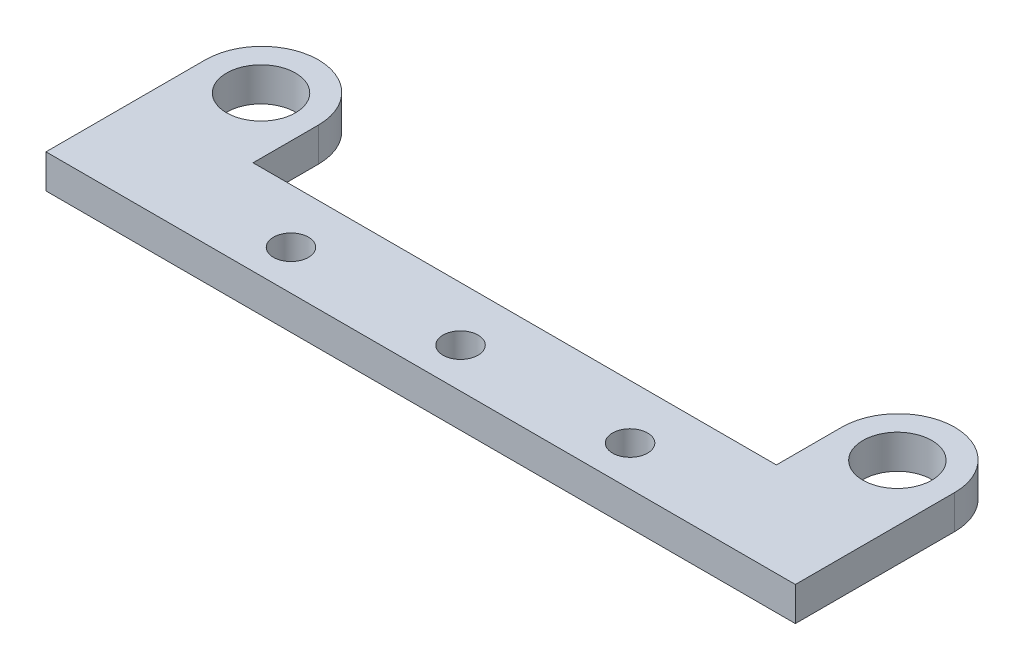
ISO-10303-21;
HEADER;
FILE_DESCRIPTION(('STEP AP214'),'2;1');
FILE_NAME('part.step','',(''),(''),'','','');
FILE_SCHEMA(('AUTOMOTIVE_DESIGN { 1 0 10303 214 1 1 1 1 }'));
ENDSEC;
DATA;
#1=APPLICATION_CONTEXT('core data for automotive mechanical design processes');
#2=APPLICATION_PROTOCOL_DEFINITION('international standard','automotive_design',2000,#1);
#3=PRODUCT_CONTEXT('',#1,'mechanical');
#4=PRODUCT('Part','Part','',(#3));
#5=PRODUCT_RELATED_PRODUCT_CATEGORY('part','',(#4));
#6=PRODUCT_DEFINITION_FORMATION('','',#4);
#7=PRODUCT_DEFINITION_CONTEXT('part definition',#1,'design');
#8=PRODUCT_DEFINITION('design','',#6,#7);
#9=PRODUCT_DEFINITION_SHAPE('','',#8);
#10=(LENGTH_UNIT() NAMED_UNIT(*) SI_UNIT(.MILLI.,.METRE.));
#11=(NAMED_UNIT(*) PLANE_ANGLE_UNIT() SI_UNIT($,.RADIAN.));
#12=(NAMED_UNIT(*) SI_UNIT($,.STERADIAN.) SOLID_ANGLE_UNIT());
#13=UNCERTAINTY_MEASURE_WITH_UNIT(LENGTH_MEASURE(1.E-05),#10,'distance_accuracy_value','');
#14=(GEOMETRIC_REPRESENTATION_CONTEXT(3) GLOBAL_UNCERTAINTY_ASSIGNED_CONTEXT((#13)) GLOBAL_UNIT_ASSIGNED_CONTEXT((#10,
#11,#12)) REPRESENTATION_CONTEXT('',''));
#15=CARTESIAN_POINT('',(0.,0.,0.));
#16=DIRECTION('',(0.,0.,1.));
#17=DIRECTION('',(1.,0.,0.));
#18=AXIS2_PLACEMENT_3D('',#15,#16,#17);
#19=CARTESIAN_POINT('',(0.,3.,0.));
#20=DIRECTION('',(0.,1.,0.));
#21=DIRECTION('',(1.,0.,0.));
#22=AXIS2_PLACEMENT_3D('',#19,#20,#21);
#23=PLANE('',#22);
#24=CARTESIAN_POINT('',(28.15,3.,5.075));
#25=DIRECTION('',(0.,-1.,0.));
#26=DIRECTION('',(0.,0.,1.));
#27=AXIS2_PLACEMENT_3D('',#24,#25,#26);
#28=CIRCLE('',#27,3.05);
#29=CARTESIAN_POINT('',(28.15,3.,2.025));
#30=VERTEX_POINT('',#29);
#31=EDGE_CURVE('E147',#30,#30,#28,.T.);
#32=ORIENTED_EDGE('',*,*,#31,.T.);
#33=EDGE_LOOP('',(#32));
#34=FACE_BOUND('',#33,.T.);
#35=CARTESIAN_POINT('',(-15.,3.,15.575));
#36=DIRECTION('',(0.,-1.,0.));
#37=DIRECTION('',(0.,0.,-1.));
#38=AXIS2_PLACEMENT_3D('',#35,#36,#37);
#39=CIRCLE('',#38,1.55);
#40=CARTESIAN_POINT('',(-15.,3.,17.125));
#41=VERTEX_POINT('',#40);
#42=EDGE_CURVE('E224',#41,#41,#39,.T.);
#43=ORIENTED_EDGE('',*,*,#42,.T.);
#44=EDGE_LOOP('',(#43));
#45=FACE_BOUND('',#44,.T.);
#46=CARTESIAN_POINT('',(0.,3.,15.575));
#47=DIRECTION('',(0.,-1.,0.));
#48=DIRECTION('',(0.,0.,-1.));
#49=AXIS2_PLACEMENT_3D('',#46,#47,#48);
#50=CIRCLE('',#49,1.55);
#51=CARTESIAN_POINT('',(0.,3.,17.125));
#52=VERTEX_POINT('',#51);
#53=EDGE_CURVE('E209',#52,#52,#50,.T.);
#54=ORIENTED_EDGE('',*,*,#53,.T.);
#55=EDGE_LOOP('',(#54));
#56=FACE_BOUND('',#55,.T.);
#57=CARTESIAN_POINT('',(15.,3.,15.575));
#58=DIRECTION('',(0.,-1.,0.));
#59=DIRECTION('',(0.,0.,-1.));
#60=AXIS2_PLACEMENT_3D('',#57,#58,#59);
#61=CIRCLE('',#60,1.55);
#62=CARTESIAN_POINT('',(15.,3.,17.125));
#63=VERTEX_POINT('',#62);
#64=EDGE_CURVE('E168',#63,#63,#61,.T.);
#65=ORIENTED_EDGE('',*,*,#64,.T.);
#66=EDGE_LOOP('',(#65));
#67=FACE_BOUND('',#66,.T.);
#68=CARTESIAN_POINT('',(-28.15,3.,5.075));
#69=DIRECTION('',(0.,-1.,0.));
#70=DIRECTION('',(0.,0.,-1.));
#71=AXIS2_PLACEMENT_3D('',#68,#69,#70);
#72=CIRCLE('',#71,3.05);
#73=CARTESIAN_POINT('',(-28.15,3.,8.125));
#74=VERTEX_POINT('',#73);
#75=EDGE_CURVE('E180',#74,#74,#72,.T.);
#76=ORIENTED_EDGE('',*,*,#75,.T.);
#77=EDGE_LOOP('',(#76));
#78=FACE_BOUND('',#77,.T.);
#79=DIRECTION('',(0.,0.,1.));
#80=VECTOR('',#79,1.);
#81=CARTESIAN_POINT('',(-23.15,3.,10.78));
#82=LINE('',#81,#80);
#83=CARTESIAN_POINT('',(-23.15,3.,5.));
#84=VERTEX_POINT('',#83);
#85=CARTESIAN_POINT('',(-23.15,3.,10.78));
#86=VERTEX_POINT('',#85);
#87=EDGE_CURVE('E215',#84,#86,#82,.T.);
#88=ORIENTED_EDGE('',*,*,#87,.F.);
#89=CARTESIAN_POINT('',(-28.15,3.,5.));
#90=DIRECTION('',(0.,-1.,0.));
#91=DIRECTION('',(0.,0.,-1.));
#92=AXIS2_PLACEMENT_3D('',#89,#90,#91);
#93=CIRCLE('',#92,5.);
#94=CARTESIAN_POINT('',(-33.15,3.,5.));
#95=VERTEX_POINT('',#94);
#96=EDGE_CURVE('E140',#95,#84,#93,.T.);
#97=ORIENTED_EDGE('',*,*,#96,.F.);
#98=DIRECTION('',(0.,0.,-1.));
#99=VECTOR('',#98,1.);
#100=CARTESIAN_POINT('',(-33.15,3.,0.));
#101=LINE('',#100,#99);
#102=CARTESIAN_POINT('',(-33.15,3.,19.1));
#103=VERTEX_POINT('',#102);
#104=EDGE_CURVE('E11',#103,#95,#101,.T.);
#105=ORIENTED_EDGE('',*,*,#104,.F.);
#106=DIRECTION('',(-1.,0.,0.));
#107=VECTOR('',#106,1.);
#108=CARTESIAN_POINT('',(-33.15,3.,19.1));
#109=LINE('',#108,#107);
#110=CARTESIAN_POINT('',(33.15,3.,19.1));
#111=VERTEX_POINT('',#110);
#112=EDGE_CURVE('E28',#111,#103,#109,.T.);
#113=ORIENTED_EDGE('',*,*,#112,.F.);
#114=DIRECTION('',(0.,0.,1.));
#115=VECTOR('',#114,1.);
#116=CARTESIAN_POINT('',(33.15,3.,19.1));
#117=LINE('',#116,#115);
#118=CARTESIAN_POINT('',(33.15,3.,5.));
#119=VERTEX_POINT('',#118);
#120=EDGE_CURVE('E129',#119,#111,#117,.T.);
#121=ORIENTED_EDGE('',*,*,#120,.F.);
#122=CARTESIAN_POINT('',(28.15,3.,5.));
#123=DIRECTION('',(0.,-1.,0.));
#124=DIRECTION('',(0.,0.,-1.));
#125=AXIS2_PLACEMENT_3D('',#122,#123,#124);
#126=CIRCLE('',#125,5.);
#127=CARTESIAN_POINT('',(23.15,3.,5.));
#128=VERTEX_POINT('',#127);
#129=EDGE_CURVE('E136',#128,#119,#126,.T.);
#130=ORIENTED_EDGE('',*,*,#129,.F.);
#131=DIRECTION('',(0.,0.,-1.));
#132=VECTOR('',#131,1.);
#133=CARTESIAN_POINT('',(23.15,3.,0.));
#134=LINE('',#133,#132);
#135=CARTESIAN_POINT('',(23.15,3.,10.78));
#136=VERTEX_POINT('',#135);
#137=EDGE_CURVE('E117',#136,#128,#134,.T.);
#138=ORIENTED_EDGE('',*,*,#137,.F.);
#139=DIRECTION('',(1.,0.,0.));
#140=VECTOR('',#139,1.);
#141=CARTESIAN_POINT('',(23.15,3.,10.78));
#142=LINE('',#141,#140);
#143=EDGE_CURVE('E130',#86,#136,#142,.T.);
#144=ORIENTED_EDGE('',*,*,#143,.F.);
#145=EDGE_LOOP('',(#88,#97,#105,#113,#121,#130,#138,#144));
#146=FACE_BOUND('',#145,.T.);
#147=ADVANCED_FACE('F17',(#34,#45,#56,#67,#78,#146),#23,.T.);
#148=CARTESIAN_POINT('',(-33.15,0.,0.));
#149=DIRECTION('',(-1.,0.,0.));
#150=DIRECTION('',(0.,0.,1.));
#151=AXIS2_PLACEMENT_3D('',#148,#149,#150);
#152=PLANE('',#151);
#153=ORIENTED_EDGE('',*,*,#104,.T.);
#154=DIRECTION('',(0.,-1.,0.));
#155=VECTOR('',#154,1.);
#156=CARTESIAN_POINT('',(-33.15,0.,5.));
#157=LINE('',#156,#155);
#158=CARTESIAN_POINT('',(-33.15,0.,5.));
#159=VERTEX_POINT('',#158);
#160=EDGE_CURVE('E179',#95,#159,#157,.T.);
#161=ORIENTED_EDGE('',*,*,#160,.T.);
#162=DIRECTION('',(0.,0.,1.));
#163=VECTOR('',#162,1.);
#164=CARTESIAN_POINT('',(-33.15,0.,0.));
#165=LINE('',#164,#163);
#166=CARTESIAN_POINT('',(-33.15,0.,19.1));
#167=VERTEX_POINT('',#166);
#168=EDGE_CURVE('E160',#159,#167,#165,.T.);
#169=ORIENTED_EDGE('',*,*,#168,.T.);
#170=DIRECTION('',(0.,-1.,0.));
#171=VECTOR('',#170,1.);
#172=CARTESIAN_POINT('',(-33.15,0.,19.1));
#173=LINE('',#172,#171);
#174=EDGE_CURVE('E167',#103,#167,#173,.T.);
#175=ORIENTED_EDGE('',*,*,#174,.F.);
#176=EDGE_LOOP('',(#153,#161,#169,#175));
#177=FACE_BOUND('',#176,.T.);
#178=ADVANCED_FACE('F284',(#177),#152,.T.);
#179=CARTESIAN_POINT('',(-33.15,0.,19.1));
#180=DIRECTION('',(0.,0.,1.));
#181=DIRECTION('',(1.,0.,0.));
#182=AXIS2_PLACEMENT_3D('',#179,#180,#181);
#183=PLANE('',#182);
#184=ORIENTED_EDGE('',*,*,#174,.T.);
#185=DIRECTION('',(1.,0.,0.));
#186=VECTOR('',#185,1.);
#187=CARTESIAN_POINT('',(0.,0.,19.1));
#188=LINE('',#187,#186);
#189=CARTESIAN_POINT('',(33.15,0.,19.1));
#190=VERTEX_POINT('',#189);
#191=EDGE_CURVE('E21',#167,#190,#188,.T.);
#192=ORIENTED_EDGE('',*,*,#191,.T.);
#193=DIRECTION('',(0.,-1.,0.));
#194=VECTOR('',#193,1.);
#195=CARTESIAN_POINT('',(33.15,0.,19.1));
#196=LINE('',#195,#194);
#197=EDGE_CURVE('E212',#111,#190,#196,.T.);
#198=ORIENTED_EDGE('',*,*,#197,.F.);
#199=ORIENTED_EDGE('',*,*,#112,.T.);
#200=EDGE_LOOP('',(#184,#192,#198,#199));
#201=FACE_BOUND('',#200,.T.);
#202=ADVANCED_FACE('F279',(#201),#183,.T.);
#203=CARTESIAN_POINT('',(33.15,0.,19.1));
#204=DIRECTION('',(1.,0.,0.));
#205=DIRECTION('',(0.,1.,0.));
#206=AXIS2_PLACEMENT_3D('',#203,#204,#205);
#207=PLANE('',#206);
#208=DIRECTION('',(0.,0.,-1.));
#209=VECTOR('',#208,1.);
#210=CARTESIAN_POINT('',(33.15,0.,0.));
#211=LINE('',#210,#209);
#212=CARTESIAN_POINT('',(33.15,0.,5.));
#213=VERTEX_POINT('',#212);
#214=EDGE_CURVE('E251',#190,#213,#211,.T.);
#215=ORIENTED_EDGE('',*,*,#214,.T.);
#216=DIRECTION('',(0.,-1.,0.));
#217=VECTOR('',#216,1.);
#218=CARTESIAN_POINT('',(33.15,9.3156,5.));
#219=LINE('',#218,#217);
#220=EDGE_CURVE('E146',#119,#213,#219,.T.);
#221=ORIENTED_EDGE('',*,*,#220,.F.);
#222=ORIENTED_EDGE('',*,*,#120,.T.);
#223=ORIENTED_EDGE('',*,*,#197,.T.);
#224=EDGE_LOOP('',(#215,#221,#222,#223));
#225=FACE_BOUND('',#224,.T.);
#226=ADVANCED_FACE('F19',(#225),#207,.T.);
#227=CARTESIAN_POINT('',(23.15,0.,0.));
#228=DIRECTION('',(-1.,0.,0.));
#229=DIRECTION('',(0.,0.,1.));
#230=AXIS2_PLACEMENT_3D('',#227,#228,#229);
#231=PLANE('',#230);
#232=ORIENTED_EDGE('',*,*,#137,.T.);
#233=DIRECTION('',(0.,-1.,0.));
#234=VECTOR('',#233,1.);
#235=CARTESIAN_POINT('',(23.15,0.,5.));
#236=LINE('',#235,#234);
#237=CARTESIAN_POINT('',(23.15,0.,5.));
#238=VERTEX_POINT('',#237);
#239=EDGE_CURVE('E121',#128,#238,#236,.T.);
#240=ORIENTED_EDGE('',*,*,#239,.T.);
#241=DIRECTION('',(0.,0.,1.));
#242=VECTOR('',#241,1.);
#243=CARTESIAN_POINT('',(23.15,0.,0.));
#244=LINE('',#243,#242);
#245=CARTESIAN_POINT('',(23.15,0.,10.78));
#246=VERTEX_POINT('',#245);
#247=EDGE_CURVE('E178',#238,#246,#244,.T.);
#248=ORIENTED_EDGE('',*,*,#247,.T.);
#249=DIRECTION('',(0.,-1.,0.));
#250=VECTOR('',#249,1.);
#251=CARTESIAN_POINT('',(23.15,0.,10.78));
#252=LINE('',#251,#250);
#253=EDGE_CURVE('E124',#136,#246,#252,.T.);
#254=ORIENTED_EDGE('',*,*,#253,.F.);
#255=EDGE_LOOP('',(#232,#240,#248,#254));
#256=FACE_BOUND('',#255,.T.);
#257=ADVANCED_FACE('F119',(#256),#231,.T.);
#258=CARTESIAN_POINT('',(23.15,0.,10.78));
#259=DIRECTION('',(0.,0.,-1.));
#260=DIRECTION('',(0.,-1.,0.));
#261=AXIS2_PLACEMENT_3D('',#258,#259,#260);
#262=PLANE('',#261);
#263=ORIENTED_EDGE('',*,*,#253,.T.);
#264=DIRECTION('',(-1.,0.,0.));
#265=VECTOR('',#264,1.);
#266=CARTESIAN_POINT('',(0.,0.,10.78));
#267=LINE('',#266,#265);
#268=CARTESIAN_POINT('',(-23.15,0.,10.78));
#269=VERTEX_POINT('',#268);
#270=EDGE_CURVE('E174',#246,#269,#267,.T.);
#271=ORIENTED_EDGE('',*,*,#270,.T.);
#272=DIRECTION('',(0.,-1.,0.));
#273=VECTOR('',#272,1.);
#274=CARTESIAN_POINT('',(-23.15,0.,10.78));
#275=LINE('',#274,#273);
#276=EDGE_CURVE('E218',#86,#269,#275,.T.);
#277=ORIENTED_EDGE('',*,*,#276,.F.);
#278=ORIENTED_EDGE('',*,*,#143,.T.);
#279=EDGE_LOOP('',(#263,#271,#277,#278));
#280=FACE_BOUND('',#279,.T.);
#281=ADVANCED_FACE('F303',(#280),#262,.T.);
#282=CARTESIAN_POINT('',(-23.15,0.,10.78));
#283=DIRECTION('',(1.,0.,0.));
#284=DIRECTION('',(0.,1.,0.));
#285=AXIS2_PLACEMENT_3D('',#282,#283,#284);
#286=PLANE('',#285);
#287=DIRECTION('',(0.,0.,-1.));
#288=VECTOR('',#287,1.);
#289=CARTESIAN_POINT('',(-23.15,0.,0.));
#290=LINE('',#289,#288);
#291=CARTESIAN_POINT('',(-23.15,0.,5.));
#292=VERTEX_POINT('',#291);
#293=EDGE_CURVE('E164',#269,#292,#290,.T.);
#294=ORIENTED_EDGE('',*,*,#293,.T.);
#295=DIRECTION('',(0.,1.,0.));
#296=VECTOR('',#295,1.);
#297=CARTESIAN_POINT('',(-23.15,0.,5.));
#298=LINE('',#297,#296);
#299=EDGE_CURVE('E186',#292,#84,#298,.T.);
#300=ORIENTED_EDGE('',*,*,#299,.T.);
#301=ORIENTED_EDGE('',*,*,#87,.T.);
#302=ORIENTED_EDGE('',*,*,#276,.T.);
#303=EDGE_LOOP('',(#294,#300,#301,#302));
#304=FACE_BOUND('',#303,.T.);
#305=ADVANCED_FACE('F439',(#304),#286,.T.);
#306=CARTESIAN_POINT('',(0.,0.,0.));
#307=DIRECTION('',(0.,1.,0.));
#308=DIRECTION('',(1.,0.,0.));
#309=AXIS2_PLACEMENT_3D('',#306,#307,#308);
#310=PLANE('',#309);
#311=CARTESIAN_POINT('',(28.15,0.,5.075));
#312=DIRECTION('',(0.,-1.,0.));
#313=DIRECTION('',(0.,0.,1.));
#314=AXIS2_PLACEMENT_3D('',#311,#312,#313);
#315=CIRCLE('',#314,3.05);
#316=CARTESIAN_POINT('',(28.15,0.,2.025));
#317=VERTEX_POINT('',#316);
#318=EDGE_CURVE('E158',#317,#317,#315,.T.);
#319=ORIENTED_EDGE('',*,*,#318,.F.);
#320=EDGE_LOOP('',(#319));
#321=FACE_BOUND('',#320,.T.);
#322=CARTESIAN_POINT('',(-15.,0.,15.575));
#323=DIRECTION('',(0.,-1.,0.));
#324=DIRECTION('',(0.,0.,-1.));
#325=AXIS2_PLACEMENT_3D('',#322,#323,#324);
#326=CIRCLE('',#325,1.55);
#327=CARTESIAN_POINT('',(-15.,0.,17.125));
#328=VERTEX_POINT('',#327);
#329=EDGE_CURVE('E223',#328,#328,#326,.T.);
#330=ORIENTED_EDGE('',*,*,#329,.F.);
#331=EDGE_LOOP('',(#330));
#332=FACE_BOUND('',#331,.T.);
#333=CARTESIAN_POINT('',(0.,0.,15.575));
#334=DIRECTION('',(0.,-1.,0.));
#335=DIRECTION('',(0.,0.,-1.));
#336=AXIS2_PLACEMENT_3D('',#333,#334,#335);
#337=CIRCLE('',#336,1.55);
#338=CARTESIAN_POINT('',(0.,0.,17.125));
#339=VERTEX_POINT('',#338);
#340=EDGE_CURVE('E241',#339,#339,#337,.T.);
#341=ORIENTED_EDGE('',*,*,#340,.F.);
#342=EDGE_LOOP('',(#341));
#343=FACE_BOUND('',#342,.T.);
#344=CARTESIAN_POINT('',(15.,0.,15.575));
#345=DIRECTION('',(0.,-1.,0.));
#346=DIRECTION('',(0.,0.,-1.));
#347=AXIS2_PLACEMENT_3D('',#344,#345,#346);
#348=CIRCLE('',#347,1.55);
#349=CARTESIAN_POINT('',(15.,0.,17.125));
#350=VERTEX_POINT('',#349);
#351=EDGE_CURVE('E206',#350,#350,#348,.T.);
#352=ORIENTED_EDGE('',*,*,#351,.F.);
#353=EDGE_LOOP('',(#352));
#354=FACE_BOUND('',#353,.T.);
#355=CARTESIAN_POINT('',(-28.15,0.,5.075));
#356=DIRECTION('',(0.,-1.,0.));
#357=DIRECTION('',(0.,0.,-1.));
#358=AXIS2_PLACEMENT_3D('',#355,#356,#357);
#359=CIRCLE('',#358,3.05);
#360=CARTESIAN_POINT('',(-28.15,0.,8.125));
#361=VERTEX_POINT('',#360);
#362=EDGE_CURVE('E173',#361,#361,#359,.T.);
#363=ORIENTED_EDGE('',*,*,#362,.F.);
#364=EDGE_LOOP('',(#363));
#365=FACE_BOUND('',#364,.T.);
#366=ORIENTED_EDGE('',*,*,#270,.F.);
#367=ORIENTED_EDGE('',*,*,#247,.F.);
#368=CARTESIAN_POINT('',(28.15,0.,5.));
#369=DIRECTION('',(0.,1.,0.));
#370=DIRECTION('',(0.,0.,-1.));
#371=AXIS2_PLACEMENT_3D('',#368,#369,#370);
#372=CIRCLE('',#371,5.);
#373=EDGE_CURVE('E138',#213,#238,#372,.T.);
#374=ORIENTED_EDGE('',*,*,#373,.F.);
#375=ORIENTED_EDGE('',*,*,#214,.F.);
#376=ORIENTED_EDGE('',*,*,#191,.F.);
#377=ORIENTED_EDGE('',*,*,#168,.F.);
#378=CARTESIAN_POINT('',(-28.15,0.,5.));
#379=DIRECTION('',(0.,1.,0.));
#380=DIRECTION('',(0.,0.,-1.));
#381=AXIS2_PLACEMENT_3D('',#378,#379,#380);
#382=CIRCLE('',#381,5.);
#383=EDGE_CURVE('E194',#292,#159,#382,.T.);
#384=ORIENTED_EDGE('',*,*,#383,.F.);
#385=ORIENTED_EDGE('',*,*,#293,.F.);
#386=EDGE_LOOP('',(#366,#367,#374,#375,#376,#377,#384,#385));
#387=FACE_BOUND('',#386,.T.);
#388=ADVANCED_FACE('F288',(#321,#332,#343,#354,#365,#387),#310,.F.);
#389=CARTESIAN_POINT('',(-28.15,9.3156,5.));
#390=DIRECTION('',(0.,-1.,0.));
#391=DIRECTION('',(0.,0.,-1.));
#392=AXIS2_PLACEMENT_3D('',#389,#390,#391);
#393=CYLINDRICAL_SURFACE('',#392,5.);
#394=ORIENTED_EDGE('',*,*,#96,.T.);
#395=ORIENTED_EDGE('',*,*,#299,.F.);
#396=ORIENTED_EDGE('',*,*,#383,.T.);
#397=ORIENTED_EDGE('',*,*,#160,.F.);
#398=EDGE_LOOP('',(#394,#395,#396,#397));
#399=FACE_BOUND('',#398,.T.);
#400=ADVANCED_FACE('F379',(#399),#393,.T.);
#401=CARTESIAN_POINT('',(28.15,9.3156,5.));
#402=DIRECTION('',(0.,-1.,0.));
#403=DIRECTION('',(0.,0.,-1.));
#404=AXIS2_PLACEMENT_3D('',#401,#402,#403);
#405=CYLINDRICAL_SURFACE('',#404,5.);
#406=ORIENTED_EDGE('',*,*,#129,.T.);
#407=ORIENTED_EDGE('',*,*,#220,.T.);
#408=ORIENTED_EDGE('',*,*,#373,.T.);
#409=ORIENTED_EDGE('',*,*,#239,.F.);
#410=EDGE_LOOP('',(#406,#407,#408,#409));
#411=FACE_BOUND('',#410,.T.);
#412=ADVANCED_FACE('F134',(#411),#405,.T.);
#413=CARTESIAN_POINT('',(28.15,3.,5.075));
#414=DIRECTION('',(0.,1.,0.));
#415=DIRECTION('',(0.,0.,1.));
#416=AXIS2_PLACEMENT_3D('',#413,#414,#415);
#417=CYLINDRICAL_SURFACE('',#416,3.05);
#418=ORIENTED_EDGE('',*,*,#318,.T.);
#419=DIRECTION('',(0.,1.,0.));
#420=VECTOR('',#419,1.);
#421=CARTESIAN_POINT('',(28.15,3.,2.025));
#422=LINE('',#421,#420);
#423=EDGE_CURVE('E155',#317,#30,#422,.T.);
#424=ORIENTED_EDGE('',*,*,#423,.T.);
#425=ORIENTED_EDGE('',*,*,#31,.F.);
#426=ORIENTED_EDGE('',*,*,#423,.F.);
#427=EDGE_LOOP('',(#418,#424,#425,#426));
#428=FACE_BOUND('',#427,.T.);
#429=ADVANCED_FACE('F326',(#428),#417,.F.);
#430=CARTESIAN_POINT('',(-15.,3.,15.575));
#431=DIRECTION('',(0.,-1.,0.));
#432=DIRECTION('',(0.,0.,-1.));
#433=AXIS2_PLACEMENT_3D('',#430,#431,#432);
#434=CYLINDRICAL_SURFACE('',#433,1.55);
#435=ORIENTED_EDGE('',*,*,#42,.F.);
#436=DIRECTION('',(0.,-1.,0.));
#437=VECTOR('',#436,1.);
#438=CARTESIAN_POINT('',(-15.,3.,17.125));
#439=LINE('',#438,#437);
#440=EDGE_CURVE('E219',#41,#328,#439,.T.);
#441=ORIENTED_EDGE('',*,*,#440,.T.);
#442=ORIENTED_EDGE('',*,*,#329,.T.);
#443=ORIENTED_EDGE('',*,*,#440,.F.);
#444=EDGE_LOOP('',(#435,#441,#442,#443));
#445=FACE_BOUND('',#444,.T.);
#446=ADVANCED_FACE('F410',(#445),#434,.F.);
#447=CARTESIAN_POINT('',(0.,3.,15.575));
#448=DIRECTION('',(0.,-1.,0.));
#449=DIRECTION('',(0.,0.,-1.));
#450=AXIS2_PLACEMENT_3D('',#447,#448,#449);
#451=CYLINDRICAL_SURFACE('',#450,1.55);
#452=ORIENTED_EDGE('',*,*,#53,.F.);
#453=DIRECTION('',(0.,-1.,0.));
#454=VECTOR('',#453,1.);
#455=CARTESIAN_POINT('',(0.,3.,17.125));
#456=LINE('',#455,#454);
#457=EDGE_CURVE('E234',#52,#339,#456,.T.);
#458=ORIENTED_EDGE('',*,*,#457,.T.);
#459=ORIENTED_EDGE('',*,*,#340,.T.);
#460=ORIENTED_EDGE('',*,*,#457,.F.);
#461=EDGE_LOOP('',(#452,#458,#459,#460));
#462=FACE_BOUND('',#461,.T.);
#463=ADVANCED_FACE('F404',(#462),#451,.F.);
#464=CARTESIAN_POINT('',(15.,3.,15.575));
#465=DIRECTION('',(0.,-1.,0.));
#466=DIRECTION('',(0.,0.,-1.));
#467=AXIS2_PLACEMENT_3D('',#464,#465,#466);
#468=CYLINDRICAL_SURFACE('',#467,1.55);
#469=ORIENTED_EDGE('',*,*,#64,.F.);
#470=DIRECTION('',(0.,-1.,0.));
#471=VECTOR('',#470,1.);
#472=CARTESIAN_POINT('',(15.,3.,17.125));
#473=LINE('',#472,#471);
#474=EDGE_CURVE('E172',#63,#350,#473,.T.);
#475=ORIENTED_EDGE('',*,*,#474,.T.);
#476=ORIENTED_EDGE('',*,*,#351,.T.);
#477=ORIENTED_EDGE('',*,*,#474,.F.);
#478=EDGE_LOOP('',(#469,#475,#476,#477));
#479=FACE_BOUND('',#478,.T.);
#480=ADVANCED_FACE('F409',(#479),#468,.F.);
#481=CARTESIAN_POINT('',(-28.15,3.,5.075));
#482=DIRECTION('',(0.,-1.,0.));
#483=DIRECTION('',(0.,0.,-1.));
#484=AXIS2_PLACEMENT_3D('',#481,#482,#483);
#485=CYLINDRICAL_SURFACE('',#484,3.05);
#486=ORIENTED_EDGE('',*,*,#75,.F.);
#487=DIRECTION('',(0.,-1.,0.));
#488=VECTOR('',#487,1.);
#489=CARTESIAN_POINT('',(-28.15,3.,8.125));
#490=LINE('',#489,#488);
#491=EDGE_CURVE('E183',#74,#361,#490,.T.);
#492=ORIENTED_EDGE('',*,*,#491,.T.);
#493=ORIENTED_EDGE('',*,*,#362,.T.);
#494=ORIENTED_EDGE('',*,*,#491,.F.);
#495=EDGE_LOOP('',(#486,#492,#493,#494));
#496=FACE_BOUND('',#495,.T.);
#497=ADVANCED_FACE('F486',(#496),#485,.F.);
#498=CLOSED_SHELL('',(#147,#178,#202,#226,#257,#281,#305,#388,#400,#412,#429,#446,#463,#480,#497));
#499=MANIFOLD_SOLID_BREP('B1',#498);
#500=ADVANCED_BREP_SHAPE_REPRESENTATION('',(#18,#499),#14);
#501=SHAPE_DEFINITION_REPRESENTATION(#9,#500);
ENDSEC;
END-ISO-10303-21;
